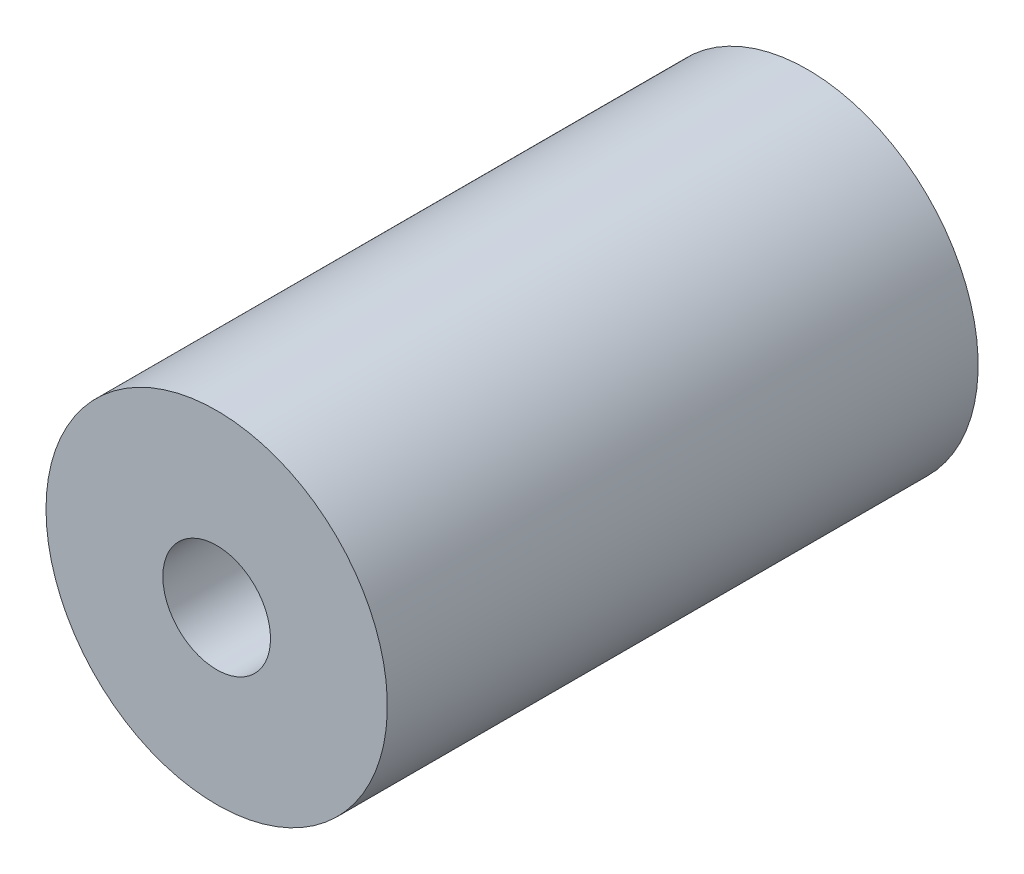
ISO-10303-21;
HEADER;
FILE_DESCRIPTION(('STEP AP214'),'2;1');
FILE_NAME('part.step','',(''),(''),'','','');
FILE_SCHEMA(('AUTOMOTIVE_DESIGN { 1 0 10303 214 1 1 1 1 }'));
ENDSEC;
DATA;
#1=APPLICATION_CONTEXT('core data for automotive mechanical design processes');
#2=APPLICATION_PROTOCOL_DEFINITION('international standard','automotive_design',2000,#1);
#3=PRODUCT_CONTEXT('',#1,'mechanical');
#4=PRODUCT('Part','Part','',(#3));
#5=PRODUCT_RELATED_PRODUCT_CATEGORY('part','',(#4));
#6=PRODUCT_DEFINITION_FORMATION('','',#4);
#7=PRODUCT_DEFINITION_CONTEXT('part definition',#1,'design');
#8=PRODUCT_DEFINITION('design','',#6,#7);
#9=PRODUCT_DEFINITION_SHAPE('','',#8);
#10=(LENGTH_UNIT() NAMED_UNIT(*) SI_UNIT(.MILLI.,.METRE.));
#11=(NAMED_UNIT(*) PLANE_ANGLE_UNIT() SI_UNIT($,.RADIAN.));
#12=(NAMED_UNIT(*) SI_UNIT($,.STERADIAN.) SOLID_ANGLE_UNIT());
#13=UNCERTAINTY_MEASURE_WITH_UNIT(LENGTH_MEASURE(1.E-05),#10,'distance_accuracy_value','');
#14=(GEOMETRIC_REPRESENTATION_CONTEXT(3) GLOBAL_UNCERTAINTY_ASSIGNED_CONTEXT((#13)) GLOBAL_UNIT_ASSIGNED_CONTEXT((#10,
#11,#12)) REPRESENTATION_CONTEXT('',''));
#15=CARTESIAN_POINT('',(0.,0.,0.));
#16=DIRECTION('',(0.,0.,1.));
#17=DIRECTION('',(1.,0.,0.));
#18=AXIS2_PLACEMENT_3D('',#15,#16,#17);
#19=CARTESIAN_POINT('',(0.,0.,45.));
#20=DIRECTION('',(0.,0.,1.));
#21=DIRECTION('',(1.,0.,0.));
#22=AXIS2_PLACEMENT_3D('',#19,#20,#21);
#23=PLANE('',#22);
#24=CARTESIAN_POINT('',(0.,0.,45.));
#25=DIRECTION('',(0.,0.,1.));
#26=DIRECTION('',(1.,0.,0.));
#27=AXIS2_PLACEMENT_3D('',#24,#25,#26);
#28=CIRCLE('',#27,13.);
#29=CARTESIAN_POINT('',(-13.,0.,45.));
#30=VERTEX_POINT('',#29);
#31=EDGE_CURVE('E10',#30,#30,#28,.T.);
#32=ORIENTED_EDGE('',*,*,#31,.T.);
#33=EDGE_LOOP('',(#32));
#34=FACE_BOUND('',#33,.T.);
#35=CARTESIAN_POINT('',(0.,0.,45.));
#36=DIRECTION('',(0.,0.,1.));
#37=DIRECTION('',(1.,0.,0.));
#38=AXIS2_PLACEMENT_3D('',#35,#36,#37);
#39=CIRCLE('',#38,4.1);
#40=CARTESIAN_POINT('',(-4.1,0.,45.));
#41=VERTEX_POINT('',#40);
#42=EDGE_CURVE('E40',#41,#41,#39,.T.);
#43=ORIENTED_EDGE('',*,*,#42,.F.);
#44=EDGE_LOOP('',(#43));
#45=FACE_BOUND('',#44,.T.);
#46=ADVANCED_FACE('F29',(#34,#45),#23,.T.);
#47=CARTESIAN_POINT('',(0.,0.,0.));
#48=DIRECTION('',(0.,0.,1.));
#49=DIRECTION('',(1.,0.,0.));
#50=AXIS2_PLACEMENT_3D('',#47,#48,#49);
#51=PLANE('',#50);
#52=CARTESIAN_POINT('',(0.,0.,0.));
#53=DIRECTION('',(0.,0.,1.));
#54=DIRECTION('',(1.,0.,0.));
#55=AXIS2_PLACEMENT_3D('',#52,#53,#54);
#56=CIRCLE('',#55,13.);
#57=CARTESIAN_POINT('',(-13.,0.,0.));
#58=VERTEX_POINT('',#57);
#59=EDGE_CURVE('E33',#58,#58,#56,.T.);
#60=ORIENTED_EDGE('',*,*,#59,.F.);
#61=EDGE_LOOP('',(#60));
#62=FACE_BOUND('',#61,.T.);
#63=CARTESIAN_POINT('',(0.,0.,0.));
#64=DIRECTION('',(0.,0.,1.));
#65=DIRECTION('',(1.,0.,0.));
#66=AXIS2_PLACEMENT_3D('',#63,#64,#65);
#67=CIRCLE('',#66,4.1);
#68=CARTESIAN_POINT('',(-4.1,0.,0.));
#69=VERTEX_POINT('',#68);
#70=EDGE_CURVE('E42',#69,#69,#67,.T.);
#71=ORIENTED_EDGE('',*,*,#70,.T.);
#72=EDGE_LOOP('',(#71));
#73=FACE_BOUND('',#72,.T.);
#74=ADVANCED_FACE('F52',(#62,#73),#51,.F.);
#75=CARTESIAN_POINT('',(0.,0.,45.));
#76=DIRECTION('',(0.,0.,-1.));
#77=DIRECTION('',(-1.,0.,0.));
#78=AXIS2_PLACEMENT_3D('',#75,#76,#77);
#79=CYLINDRICAL_SURFACE('',#78,13.);
#80=CARTESIAN_POINT('',(-13.,0.,45.));
#81=CARTESIAN_POINT('',(-13.,0.,44.53125));
#82=CARTESIAN_POINT('',(-13.,0.,44.0625));
#83=CARTESIAN_POINT('',(-13.,0.,43.125));
#84=CARTESIAN_POINT('',(-13.,0.,42.65625));
#85=CARTESIAN_POINT('',(-13.,0.,41.71875));
#86=CARTESIAN_POINT('',(-13.,0.,41.25));
#87=CARTESIAN_POINT('',(-13.,0.,40.3125));
#88=CARTESIAN_POINT('',(-13.,0.,39.84375));
#89=CARTESIAN_POINT('',(-13.,0.,38.90625));
#90=CARTESIAN_POINT('',(-13.,0.,38.4375));
#91=CARTESIAN_POINT('',(-13.,0.,37.5));
#92=CARTESIAN_POINT('',(-13.,0.,37.03125));
#93=CARTESIAN_POINT('',(-13.,0.,36.09375));
#94=CARTESIAN_POINT('',(-13.,0.,35.625));
#95=CARTESIAN_POINT('',(-13.,0.,34.6875));
#96=CARTESIAN_POINT('',(-13.,0.,34.21875));
#97=CARTESIAN_POINT('',(-13.,0.,33.28125));
#98=CARTESIAN_POINT('',(-13.,0.,32.8125));
#99=CARTESIAN_POINT('',(-13.,0.,31.875));
#100=CARTESIAN_POINT('',(-13.,0.,31.40625));
#101=CARTESIAN_POINT('',(-13.,0.,30.46875));
#102=CARTESIAN_POINT('',(-13.,0.,30.));
#103=CARTESIAN_POINT('',(-13.,0.,29.0625));
#104=CARTESIAN_POINT('',(-13.,0.,28.59375));
#105=CARTESIAN_POINT('',(-13.,0.,27.65625));
#106=CARTESIAN_POINT('',(-13.,0.,27.1875));
#107=CARTESIAN_POINT('',(-13.,0.,26.25));
#108=CARTESIAN_POINT('',(-13.,0.,25.78125));
#109=CARTESIAN_POINT('',(-13.,0.,24.84375));
#110=CARTESIAN_POINT('',(-13.,0.,24.375));
#111=CARTESIAN_POINT('',(-13.,0.,23.4375));
#112=CARTESIAN_POINT('',(-13.,0.,22.96875));
#113=CARTESIAN_POINT('',(-13.,0.,22.03125));
#114=CARTESIAN_POINT('',(-13.,0.,21.5625));
#115=CARTESIAN_POINT('',(-13.,0.,20.625));
#116=CARTESIAN_POINT('',(-13.,0.,20.15625));
#117=CARTESIAN_POINT('',(-13.,0.,19.21875));
#118=CARTESIAN_POINT('',(-13.,0.,18.75));
#119=CARTESIAN_POINT('',(-13.,0.,17.8125));
#120=CARTESIAN_POINT('',(-13.,0.,17.34375));
#121=CARTESIAN_POINT('',(-13.,0.,16.40625));
#122=CARTESIAN_POINT('',(-13.,0.,15.9375));
#123=CARTESIAN_POINT('',(-13.,0.,15.));
#124=CARTESIAN_POINT('',(-13.,0.,14.53125));
#125=CARTESIAN_POINT('',(-13.,0.,13.59375));
#126=CARTESIAN_POINT('',(-13.,0.,13.125));
#127=CARTESIAN_POINT('',(-13.,0.,12.1875));
#128=CARTESIAN_POINT('',(-13.,0.,11.71875));
#129=CARTESIAN_POINT('',(-13.,0.,10.78125));
#130=CARTESIAN_POINT('',(-13.,0.,10.3125));
#131=CARTESIAN_POINT('',(-13.,0.,9.375));
#132=CARTESIAN_POINT('',(-13.,0.,8.90625));
#133=CARTESIAN_POINT('',(-13.,0.,7.96874999999999));
#134=CARTESIAN_POINT('',(-13.,0.,7.5));
#135=CARTESIAN_POINT('',(-13.,0.,6.5625));
#136=CARTESIAN_POINT('',(-13.,0.,6.09375));
#137=CARTESIAN_POINT('',(-13.,0.,5.15625));
#138=CARTESIAN_POINT('',(-13.,0.,4.68749999999999));
#139=CARTESIAN_POINT('',(-13.,0.,3.74999999999999));
#140=CARTESIAN_POINT('',(-13.,0.,3.28124999999999));
#141=CARTESIAN_POINT('',(-13.,0.,2.34374999999999));
#142=CARTESIAN_POINT('',(-13.,0.,1.87499999999999));
#143=CARTESIAN_POINT('',(-13.,0.,0.937499999999992));
#144=CARTESIAN_POINT('',(-13.,0.,0.468749999999993));
#145=CARTESIAN_POINT('',(-13.,0.,0.));
#146=B_SPLINE_CURVE_WITH_KNOTS('',3,(#80,#81,#82,#83,#84,#85,#86,#87,#88,#89,#90,#91,#92,#93,
#94,#95,#96,#97,#98,#99,#100,#101,#102,#103,#104,#105,#106,#107,#108,#109,#110,#111,#112,#113,
#114,#115,#116,#117,#118,#119,#120,#121,#122,#123,#124,#125,#126,#127,#128,#129,#130,#131,#132,
#133,#134,#135,#136,#137,#138,#139,#140,#141,#142,#143,#144,#145),.UNSPECIFIED.,.F.,.F.,(4,2,2,
2,2,2,2,2,2,2,2,2,2,2,2,2,2,2,2,2,2,2,2,2,2,2,2,2,2,2,2,2,4),(0.,1.40625,2.8125,
4.21875000000001,5.62500000000001,7.03125,8.4375,9.84375000000001,11.25,12.65625,14.0625,
15.46875,16.875,18.28125,19.6875,21.09375,22.5,23.90625,25.3125,26.71875,28.125,29.53125,
30.9375,32.34375,33.75,35.15625,36.5625,37.96875,39.375,40.78125,42.1875,43.59375,45.),.UNSPECIFIED.);
#147=EDGE_CURVE('BSEAM31',#30,#58,#146,.T.);
#148=ORIENTED_EDGE('',*,*,#31,.F.);
#149=ORIENTED_EDGE('',*,*,#59,.T.);
#150=ORIENTED_EDGE('',*,*,#147,.T.);
#151=ORIENTED_EDGE('',*,*,#147,.F.);
#152=EDGE_LOOP('',(#148,#150,#149,#151));
#153=FACE_BOUND('',#152,.T.);
#154=ADVANCED_FACE('F31',(#153),#79,.T.);
#155=CARTESIAN_POINT('',(0.,0.,45.));
#156=DIRECTION('',(0.,0.,-1.));
#157=DIRECTION('',(-1.,0.,0.));
#158=AXIS2_PLACEMENT_3D('',#155,#156,#157);
#159=CYLINDRICAL_SURFACE('',#158,4.1);
#160=CARTESIAN_POINT('',(-4.1,0.,45.));
#161=CARTESIAN_POINT('',(-4.1,0.,44.53125));
#162=CARTESIAN_POINT('',(-4.1,0.,44.0625));
#163=CARTESIAN_POINT('',(-4.1,0.,43.125));
#164=CARTESIAN_POINT('',(-4.1,0.,42.65625));
#165=CARTESIAN_POINT('',(-4.1,0.,41.71875));
#166=CARTESIAN_POINT('',(-4.1,0.,41.25));
#167=CARTESIAN_POINT('',(-4.1,0.,40.3125));
#168=CARTESIAN_POINT('',(-4.1,0.,39.84375));
#169=CARTESIAN_POINT('',(-4.1,0.,38.90625));
#170=CARTESIAN_POINT('',(-4.1,0.,38.4375));
#171=CARTESIAN_POINT('',(-4.1,0.,37.5));
#172=CARTESIAN_POINT('',(-4.1,0.,37.03125));
#173=CARTESIAN_POINT('',(-4.1,0.,36.09375));
#174=CARTESIAN_POINT('',(-4.1,0.,35.625));
#175=CARTESIAN_POINT('',(-4.1,0.,34.6875));
#176=CARTESIAN_POINT('',(-4.1,0.,34.21875));
#177=CARTESIAN_POINT('',(-4.1,0.,33.28125));
#178=CARTESIAN_POINT('',(-4.1,0.,32.8125));
#179=CARTESIAN_POINT('',(-4.1,0.,31.875));
#180=CARTESIAN_POINT('',(-4.1,0.,31.40625));
#181=CARTESIAN_POINT('',(-4.1,0.,30.46875));
#182=CARTESIAN_POINT('',(-4.1,0.,30.));
#183=CARTESIAN_POINT('',(-4.1,0.,29.0625));
#184=CARTESIAN_POINT('',(-4.1,0.,28.59375));
#185=CARTESIAN_POINT('',(-4.1,0.,27.65625));
#186=CARTESIAN_POINT('',(-4.1,0.,27.1875));
#187=CARTESIAN_POINT('',(-4.1,0.,26.25));
#188=CARTESIAN_POINT('',(-4.1,0.,25.78125));
#189=CARTESIAN_POINT('',(-4.1,0.,24.84375));
#190=CARTESIAN_POINT('',(-4.1,0.,24.375));
#191=CARTESIAN_POINT('',(-4.1,0.,23.4375));
#192=CARTESIAN_POINT('',(-4.1,0.,22.96875));
#193=CARTESIAN_POINT('',(-4.1,0.,22.03125));
#194=CARTESIAN_POINT('',(-4.1,0.,21.5625));
#195=CARTESIAN_POINT('',(-4.1,0.,20.625));
#196=CARTESIAN_POINT('',(-4.1,0.,20.15625));
#197=CARTESIAN_POINT('',(-4.1,0.,19.21875));
#198=CARTESIAN_POINT('',(-4.1,0.,18.75));
#199=CARTESIAN_POINT('',(-4.1,0.,17.8125));
#200=CARTESIAN_POINT('',(-4.1,0.,17.34375));
#201=CARTESIAN_POINT('',(-4.1,0.,16.40625));
#202=CARTESIAN_POINT('',(-4.1,0.,15.9375));
#203=CARTESIAN_POINT('',(-4.1,0.,15.));
#204=CARTESIAN_POINT('',(-4.1,0.,14.53125));
#205=CARTESIAN_POINT('',(-4.1,0.,13.59375));
#206=CARTESIAN_POINT('',(-4.1,0.,13.125));
#207=CARTESIAN_POINT('',(-4.1,0.,12.1875));
#208=CARTESIAN_POINT('',(-4.1,0.,11.71875));
#209=CARTESIAN_POINT('',(-4.1,0.,10.78125));
#210=CARTESIAN_POINT('',(-4.1,0.,10.3125));
#211=CARTESIAN_POINT('',(-4.1,0.,9.375));
#212=CARTESIAN_POINT('',(-4.1,0.,8.90625));
#213=CARTESIAN_POINT('',(-4.1,0.,7.96874999999999));
#214=CARTESIAN_POINT('',(-4.1,0.,7.5));
#215=CARTESIAN_POINT('',(-4.1,0.,6.5625));
#216=CARTESIAN_POINT('',(-4.1,0.,6.09375));
#217=CARTESIAN_POINT('',(-4.1,0.,5.15625));
#218=CARTESIAN_POINT('',(-4.1,0.,4.68749999999999));
#219=CARTESIAN_POINT('',(-4.1,0.,3.74999999999999));
#220=CARTESIAN_POINT('',(-4.1,0.,3.28124999999999));
#221=CARTESIAN_POINT('',(-4.1,0.,2.34374999999999));
#222=CARTESIAN_POINT('',(-4.1,0.,1.87499999999999));
#223=CARTESIAN_POINT('',(-4.1,0.,0.937499999999992));
#224=CARTESIAN_POINT('',(-4.1,0.,0.468749999999993));
#225=CARTESIAN_POINT('',(-4.1,0.,0.));
#226=B_SPLINE_CURVE_WITH_KNOTS('',3,(#160,#161,#162,#163,#164,#165,#166,#167,#168,#169,#170,
#171,#172,#173,#174,#175,#176,#177,#178,#179,#180,#181,#182,#183,#184,#185,#186,#187,#188,#189,
#190,#191,#192,#193,#194,#195,#196,#197,#198,#199,#200,#201,#202,#203,#204,#205,#206,#207,#208,
#209,#210,#211,#212,#213,#214,#215,#216,#217,#218,#219,#220,#221,#222,#223,#224,#225),
.UNSPECIFIED.,.F.,.F.,(4,2,2,2,2,2,2,2,2,2,2,2,2,2,2,2,2,2,2,2,2,2,2,2,2,2,2,2,2,2,2,2,4),(0.,
1.40625,2.8125,4.21875000000001,5.62500000000001,7.03125,8.4375,9.84375000000001,11.25,12.65625,
14.0625,15.46875,16.875,18.28125,19.6875,21.09375,22.5,23.90625,25.3125,26.71875,28.125,
29.53125,30.9375,32.34375,33.75,35.15625,36.5625,37.96875,39.375,40.78125,42.1875,43.59375,45.),.UNSPECIFIED.);
#227=EDGE_CURVE('BSEAM48',#41,#69,#226,.T.);
#228=ORIENTED_EDGE('',*,*,#42,.T.);
#229=ORIENTED_EDGE('',*,*,#70,.F.);
#230=ORIENTED_EDGE('',*,*,#227,.T.);
#231=ORIENTED_EDGE('',*,*,#227,.F.);
#232=EDGE_LOOP('',(#228,#230,#229,#231));
#233=FACE_BOUND('',#232,.T.);
#234=ADVANCED_FACE('F48',(#233),#159,.F.);
#235=CLOSED_SHELL('',(#46,#74,#154,#234));
#236=MANIFOLD_SOLID_BREP('B2',#235);
#237=ADVANCED_BREP_SHAPE_REPRESENTATION('',(#18,#236),#14);
#238=SHAPE_DEFINITION_REPRESENTATION(#9,#237);
ENDSEC;
END-ISO-10303-21;
